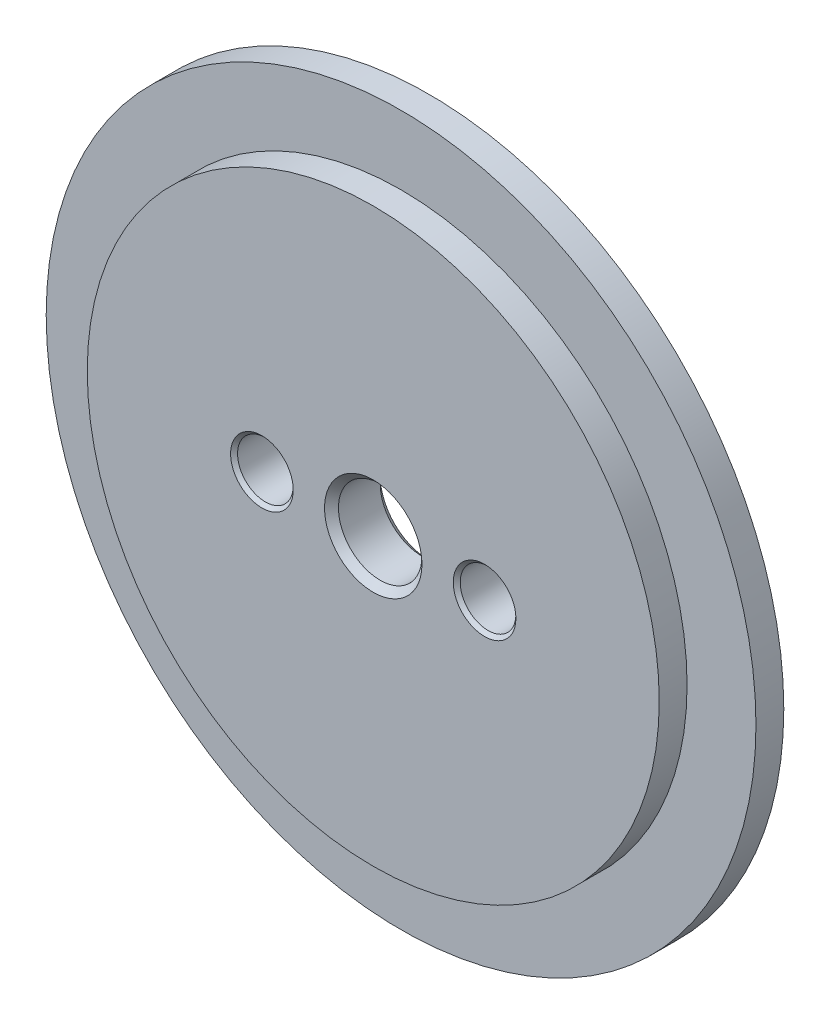
ISO-10303-21;
HEADER;
FILE_DESCRIPTION(('STEP AP214'),'2;1');
FILE_NAME('part.step','',(''),(''),'','','');
FILE_SCHEMA(('AUTOMOTIVE_DESIGN { 1 0 10303 214 1 1 1 1 }'));
ENDSEC;
DATA;
#1=APPLICATION_CONTEXT('core data for automotive mechanical design processes');
#2=APPLICATION_PROTOCOL_DEFINITION('international standard','automotive_design',2000,#1);
#3=PRODUCT_CONTEXT('',#1,'mechanical');
#4=PRODUCT('Part','Part','',(#3));
#5=PRODUCT_RELATED_PRODUCT_CATEGORY('part','',(#4));
#6=PRODUCT_DEFINITION_FORMATION('','',#4);
#7=PRODUCT_DEFINITION_CONTEXT('part definition',#1,'design');
#8=PRODUCT_DEFINITION('design','',#6,#7);
#9=PRODUCT_DEFINITION_SHAPE('','',#8);
#10=(LENGTH_UNIT() NAMED_UNIT(*) SI_UNIT(.MILLI.,.METRE.));
#11=(NAMED_UNIT(*) PLANE_ANGLE_UNIT() SI_UNIT($,.RADIAN.));
#12=(NAMED_UNIT(*) SI_UNIT($,.STERADIAN.) SOLID_ANGLE_UNIT());
#13=UNCERTAINTY_MEASURE_WITH_UNIT(LENGTH_MEASURE(1.E-05),#10,'distance_accuracy_value','');
#14=(GEOMETRIC_REPRESENTATION_CONTEXT(3) GLOBAL_UNCERTAINTY_ASSIGNED_CONTEXT((#13)) GLOBAL_UNIT_ASSIGNED_CONTEXT((#10,
#11,#12)) REPRESENTATION_CONTEXT('',''));
#15=CARTESIAN_POINT('',(0.,0.,0.));
#16=DIRECTION('',(0.,0.,1.));
#17=DIRECTION('',(1.,0.,0.));
#18=AXIS2_PLACEMENT_3D('',#15,#16,#17);
#19=CARTESIAN_POINT('',(0.,0.,2.));
#20=DIRECTION('',(0.,0.,-1.));
#21=DIRECTION('',(-1.,0.,0.));
#22=AXIS2_PLACEMENT_3D('',#19,#20,#21);
#23=CYLINDRICAL_SURFACE('',#22,25.5);
#24=CARTESIAN_POINT('',(0.,0.,2.));
#25=DIRECTION('',(0.,0.,1.));
#26=DIRECTION('',(1.,0.,0.));
#27=AXIS2_PLACEMENT_3D('',#24,#25,#26);
#28=CIRCLE('',#27,25.5);
#29=CARTESIAN_POINT('',(25.5,0.,2.));
#30=VERTEX_POINT('',#29);
#31=EDGE_CURVE('E87',#30,#30,#28,.T.);
#32=ORIENTED_EDGE('',*,*,#31,.F.);
#33=EDGE_LOOP('',(#32));
#34=FACE_BOUND('',#33,.T.);
#35=CARTESIAN_POINT('',(0.,0.,0.));
#36=DIRECTION('',(0.,0.,1.));
#37=DIRECTION('',(1.,0.,0.));
#38=AXIS2_PLACEMENT_3D('',#35,#36,#37);
#39=CIRCLE('',#38,25.5);
#40=CARTESIAN_POINT('',(25.5,0.,0.));
#41=VERTEX_POINT('',#40);
#42=EDGE_CURVE('E84',#41,#41,#39,.T.);
#43=ORIENTED_EDGE('',*,*,#42,.T.);
#44=EDGE_LOOP('',(#43));
#45=FACE_BOUND('',#44,.T.);
#46=ADVANCED_FACE('F38',(#34,#45),#23,.T.);
#47=CARTESIAN_POINT('',(0.,0.,2.));
#48=DIRECTION('',(0.,0.,1.));
#49=DIRECTION('',(1.,0.,0.));
#50=AXIS2_PLACEMENT_3D('',#47,#48,#49);
#51=PLANE('',#50);
#52=CARTESIAN_POINT('',(0.,0.,2.));
#53=DIRECTION('',(0.,0.,1.));
#54=DIRECTION('',(1.,0.,0.));
#55=AXIS2_PLACEMENT_3D('',#52,#53,#54);
#56=CIRCLE('',#55,20.55);
#57=CARTESIAN_POINT('',(20.55,0.,2.));
#58=VERTEX_POINT('',#57);
#59=EDGE_CURVE('E83',#58,#58,#56,.T.);
#60=ORIENTED_EDGE('',*,*,#59,.F.);
#61=EDGE_LOOP('',(#60));
#62=FACE_BOUND('',#61,.T.);
#63=ORIENTED_EDGE('',*,*,#31,.T.);
#64=EDGE_LOOP('',(#63));
#65=FACE_BOUND('',#64,.T.);
#66=ADVANCED_FACE('F105',(#62,#65),#51,.T.);
#67=CARTESIAN_POINT('',(0.,0.,0.));
#68=DIRECTION('',(0.,0.,1.));
#69=DIRECTION('',(1.,0.,0.));
#70=AXIS2_PLACEMENT_3D('',#67,#68,#69);
#71=PLANE('',#70);
#72=CARTESIAN_POINT('',(0.,0.,0.));
#73=DIRECTION('',(0.,0.,1.));
#74=DIRECTION('',(1.,0.,0.));
#75=AXIS2_PLACEMENT_3D('',#72,#73,#74);
#76=CIRCLE('',#75,3.49999999999999);
#77=CARTESIAN_POINT('',(3.49999999999999,0.,0.));
#78=VERTEX_POINT('',#77);
#79=EDGE_CURVE('E46',#78,#78,#76,.T.);
#80=ORIENTED_EDGE('',*,*,#79,.T.);
#81=EDGE_LOOP('',(#80));
#82=FACE_BOUND('',#81,.T.);
#83=CARTESIAN_POINT('',(-8.,0.,0.));
#84=DIRECTION('',(0.,0.,1.));
#85=DIRECTION('',(1.,0.,0.));
#86=AXIS2_PLACEMENT_3D('',#83,#84,#85);
#87=CIRCLE('',#86,2.25);
#88=CARTESIAN_POINT('',(-5.75,0.,0.));
#89=VERTEX_POINT('',#88);
#90=EDGE_CURVE('E62',#89,#89,#87,.T.);
#91=ORIENTED_EDGE('',*,*,#90,.T.);
#92=EDGE_LOOP('',(#91));
#93=FACE_BOUND('',#92,.T.);
#94=CARTESIAN_POINT('',(8.,0.,0.));
#95=DIRECTION('',(0.,0.,1.));
#96=DIRECTION('',(1.,0.,0.));
#97=AXIS2_PLACEMENT_3D('',#94,#95,#96);
#98=CIRCLE('',#97,2.25000000000001);
#99=CARTESIAN_POINT('',(10.25,0.,0.));
#100=VERTEX_POINT('',#99);
#101=EDGE_CURVE('E74',#100,#100,#98,.T.);
#102=ORIENTED_EDGE('',*,*,#101,.T.);
#103=EDGE_LOOP('',(#102));
#104=FACE_BOUND('',#103,.T.);
#105=ORIENTED_EDGE('',*,*,#42,.F.);
#106=EDGE_LOOP('',(#105));
#107=FACE_BOUND('',#106,.T.);
#108=ADVANCED_FACE('F101',(#82,#93,#104,#107),#71,.F.);
#109=CARTESIAN_POINT('',(0.,0.,4.));
#110=DIRECTION('',(0.,0.,-1.));
#111=DIRECTION('',(-1.,0.,0.));
#112=AXIS2_PLACEMENT_3D('',#109,#110,#111);
#113=CYLINDRICAL_SURFACE('',#112,20.55);
#114=CARTESIAN_POINT('',(0.,0.,4.));
#115=DIRECTION('',(0.,0.,1.));
#116=DIRECTION('',(1.,0.,0.));
#117=AXIS2_PLACEMENT_3D('',#114,#115,#116);
#118=CIRCLE('',#117,20.55);
#119=CARTESIAN_POINT('',(20.55,0.,4.));
#120=VERTEX_POINT('',#119);
#121=EDGE_CURVE('E88',#120,#120,#118,.T.);
#122=ORIENTED_EDGE('',*,*,#121,.F.);
#123=EDGE_LOOP('',(#122));
#124=FACE_BOUND('',#123,.T.);
#125=ORIENTED_EDGE('',*,*,#59,.T.);
#126=EDGE_LOOP('',(#125));
#127=FACE_BOUND('',#126,.T.);
#128=ADVANCED_FACE('F98',(#124,#127),#113,.T.);
#129=CARTESIAN_POINT('',(0.,0.,4.));
#130=DIRECTION('',(0.,0.,1.));
#131=DIRECTION('',(1.,0.,0.));
#132=AXIS2_PLACEMENT_3D('',#129,#130,#131);
#133=PLANE('',#132);
#134=CARTESIAN_POINT('',(0.,0.,4.));
#135=DIRECTION('',(0.,0.,1.));
#136=DIRECTION('',(1.,0.,0.));
#137=AXIS2_PLACEMENT_3D('',#134,#135,#136);
#138=CIRCLE('',#137,3.50000000000002);
#139=CARTESIAN_POINT('',(3.50000000000002,0.,4.));
#140=VERTEX_POINT('',#139);
#141=EDGE_CURVE('E10',#140,#140,#138,.F.);
#142=ORIENTED_EDGE('',*,*,#141,.T.);
#143=EDGE_LOOP('',(#142));
#144=FACE_BOUND('',#143,.T.);
#145=CARTESIAN_POINT('',(-8.,0.,4.));
#146=DIRECTION('',(0.,0.,1.));
#147=DIRECTION('',(1.,0.,0.));
#148=AXIS2_PLACEMENT_3D('',#145,#146,#147);
#149=CIRCLE('',#148,2.25000000000002);
#150=CARTESIAN_POINT('',(-5.74999999999998,0.,4.));
#151=VERTEX_POINT('',#150);
#152=EDGE_CURVE('E59',#151,#151,#149,.F.);
#153=ORIENTED_EDGE('',*,*,#152,.T.);
#154=EDGE_LOOP('',(#153));
#155=FACE_BOUND('',#154,.T.);
#156=CARTESIAN_POINT('',(8.,0.,4.));
#157=DIRECTION('',(0.,0.,1.));
#158=DIRECTION('',(1.,0.,0.));
#159=AXIS2_PLACEMENT_3D('',#156,#157,#158);
#160=CIRCLE('',#159,2.25000000000001);
#161=CARTESIAN_POINT('',(10.25,0.,4.));
#162=VERTEX_POINT('',#161);
#163=EDGE_CURVE('E71',#162,#162,#160,.F.);
#164=ORIENTED_EDGE('',*,*,#163,.T.);
#165=EDGE_LOOP('',(#164));
#166=FACE_BOUND('',#165,.T.);
#167=ORIENTED_EDGE('',*,*,#121,.T.);
#168=EDGE_LOOP('',(#167));
#169=FACE_BOUND('',#168,.T.);
#170=ADVANCED_FACE('F96',(#144,#155,#166,#169),#133,.T.);
#171=CARTESIAN_POINT('',(0.,0.,4.));
#172=DIRECTION('',(0.,0.,-1.));
#173=DIRECTION('',(-1.,0.,0.));
#174=AXIS2_PLACEMENT_3D('',#171,#172,#173);
#175=CYLINDRICAL_SURFACE('',#174,3.);
#176=CARTESIAN_POINT('',(0.,0.,0.499999999999993));
#177=DIRECTION('',(0.,0.,1.));
#178=DIRECTION('',(1.,0.,0.));
#179=AXIS2_PLACEMENT_3D('',#176,#177,#178);
#180=CIRCLE('',#179,3.);
#181=CARTESIAN_POINT('',(3.,0.,0.499999999999993));
#182=VERTEX_POINT('',#181);
#183=EDGE_CURVE('E50',#182,#182,#180,.F.);
#184=ORIENTED_EDGE('',*,*,#183,.T.);
#185=EDGE_LOOP('',(#184));
#186=FACE_BOUND('',#185,.T.);
#187=CARTESIAN_POINT('',(0.,0.,3.49999999999999));
#188=DIRECTION('',(0.,0.,1.));
#189=DIRECTION('',(1.,0.,0.));
#190=AXIS2_PLACEMENT_3D('',#187,#188,#189);
#191=CIRCLE('',#190,3.);
#192=CARTESIAN_POINT('',(3.,0.,3.49999999999999));
#193=VERTEX_POINT('',#192);
#194=EDGE_CURVE('E54',#193,#193,#191,.T.);
#195=ORIENTED_EDGE('',*,*,#194,.T.);
#196=EDGE_LOOP('',(#195));
#197=FACE_BOUND('',#196,.T.);
#198=ADVANCED_FACE('F163',(#186,#197),#175,.F.);
#199=CARTESIAN_POINT('',(-8.,0.,4.));
#200=DIRECTION('',(0.,0.,-1.));
#201=DIRECTION('',(-1.,0.,0.));
#202=AXIS2_PLACEMENT_3D('',#199,#200,#201);
#203=CYLINDRICAL_SURFACE('',#202,2.);
#204=CARTESIAN_POINT('',(-8.,0.,0.250000000000009));
#205=DIRECTION('',(0.,0.,1.));
#206=DIRECTION('',(1.,0.,0.));
#207=AXIS2_PLACEMENT_3D('',#204,#205,#206);
#208=CIRCLE('',#207,2.);
#209=CARTESIAN_POINT('',(-6.,0.,0.250000000000009));
#210=VERTEX_POINT('',#209);
#211=EDGE_CURVE('E65',#210,#210,#208,.F.);
#212=ORIENTED_EDGE('',*,*,#211,.T.);
#213=EDGE_LOOP('',(#212));
#214=FACE_BOUND('',#213,.T.);
#215=CARTESIAN_POINT('',(-8.,0.,3.74999999999998));
#216=DIRECTION('',(0.,0.,1.));
#217=DIRECTION('',(1.,0.,0.));
#218=AXIS2_PLACEMENT_3D('',#215,#216,#217);
#219=CIRCLE('',#218,2.);
#220=CARTESIAN_POINT('',(-6.,0.,3.74999999999998));
#221=VERTEX_POINT('',#220);
#222=EDGE_CURVE('E68',#221,#221,#219,.T.);
#223=ORIENTED_EDGE('',*,*,#222,.T.);
#224=EDGE_LOOP('',(#223));
#225=FACE_BOUND('',#224,.T.);
#226=ADVANCED_FACE('F166',(#214,#225),#203,.F.);
#227=CARTESIAN_POINT('',(8.,0.,4.));
#228=DIRECTION('',(0.,0.,-1.));
#229=DIRECTION('',(-1.,0.,0.));
#230=AXIS2_PLACEMENT_3D('',#227,#228,#229);
#231=CYLINDRICAL_SURFACE('',#230,2.);
#232=CARTESIAN_POINT('',(8.,0.,0.250000000000008));
#233=DIRECTION('',(0.,0.,1.));
#234=DIRECTION('',(1.,0.,0.));
#235=AXIS2_PLACEMENT_3D('',#232,#233,#234);
#236=CIRCLE('',#235,2.);
#237=CARTESIAN_POINT('',(10.,0.,0.250000000000008));
#238=VERTEX_POINT('',#237);
#239=EDGE_CURVE('E77',#238,#238,#236,.F.);
#240=ORIENTED_EDGE('',*,*,#239,.T.);
#241=EDGE_LOOP('',(#240));
#242=FACE_BOUND('',#241,.T.);
#243=CARTESIAN_POINT('',(8.,0.,3.75));
#244=DIRECTION('',(0.,0.,1.));
#245=DIRECTION('',(1.,0.,0.));
#246=AXIS2_PLACEMENT_3D('',#243,#244,#245);
#247=CIRCLE('',#246,2.);
#248=CARTESIAN_POINT('',(10.,0.,3.75));
#249=VERTEX_POINT('',#248);
#250=EDGE_CURVE('E80',#249,#249,#247,.T.);
#251=ORIENTED_EDGE('',*,*,#250,.T.);
#252=EDGE_LOOP('',(#251));
#253=FACE_BOUND('',#252,.T.);
#254=ADVANCED_FACE('F130',(#242,#253),#231,.F.);
#255=CARTESIAN_POINT('',(8.,0.,0.250000000000008));
#256=DIRECTION('',(0.,0.,-1.));
#257=DIRECTION('',(-1.,0.,0.));
#258=AXIS2_PLACEMENT_3D('',#255,#256,#257);
#259=CONICAL_SURFACE('',#258,2.,0.785398163397448);
#260=ORIENTED_EDGE('',*,*,#101,.F.);
#261=EDGE_LOOP('',(#260));
#262=FACE_BOUND('',#261,.T.);
#263=ORIENTED_EDGE('',*,*,#239,.F.);
#264=EDGE_LOOP('',(#263));
#265=FACE_BOUND('',#264,.T.);
#266=ADVANCED_FACE('F123',(#262,#265),#259,.F.);
#267=CARTESIAN_POINT('',(8.,0.,4.));
#268=DIRECTION('',(0.,0.,1.));
#269=DIRECTION('',(1.,0.,0.));
#270=AXIS2_PLACEMENT_3D('',#267,#268,#269);
#271=CONICAL_SURFACE('',#270,2.25000000000001,0.785398163397462);
#272=ORIENTED_EDGE('',*,*,#250,.F.);
#273=EDGE_LOOP('',(#272));
#274=FACE_BOUND('',#273,.T.);
#275=ORIENTED_EDGE('',*,*,#163,.F.);
#276=EDGE_LOOP('',(#275));
#277=FACE_BOUND('',#276,.T.);
#278=ADVANCED_FACE('F129',(#274,#277),#271,.F.);
#279=CARTESIAN_POINT('',(-8.,0.,0.250000000000009));
#280=DIRECTION('',(0.,0.,-1.));
#281=DIRECTION('',(-1.,0.,0.));
#282=AXIS2_PLACEMENT_3D('',#279,#280,#281);
#283=CONICAL_SURFACE('',#282,2.,0.785398163397434);
#284=ORIENTED_EDGE('',*,*,#90,.F.);
#285=EDGE_LOOP('',(#284));
#286=FACE_BOUND('',#285,.T.);
#287=ORIENTED_EDGE('',*,*,#211,.F.);
#288=EDGE_LOOP('',(#287));
#289=FACE_BOUND('',#288,.T.);
#290=ADVANCED_FACE('F137',(#286,#289),#283,.F.);
#291=CARTESIAN_POINT('',(-8.,0.,4.));
#292=DIRECTION('',(0.,0.,1.));
#293=DIRECTION('',(1.,0.,0.));
#294=AXIS2_PLACEMENT_3D('',#291,#292,#293);
#295=CONICAL_SURFACE('',#294,2.25000000000002,0.785398163397448);
#296=ORIENTED_EDGE('',*,*,#222,.F.);
#297=EDGE_LOOP('',(#296));
#298=FACE_BOUND('',#297,.T.);
#299=ORIENTED_EDGE('',*,*,#152,.F.);
#300=EDGE_LOOP('',(#299));
#301=FACE_BOUND('',#300,.T.);
#302=ADVANCED_FACE('F144',(#298,#301),#295,.F.);
#303=CARTESIAN_POINT('',(0.,0.,0.499999999999993));
#304=DIRECTION('',(0.,0.,-1.));
#305=DIRECTION('',(-1.,0.,0.));
#306=AXIS2_PLACEMENT_3D('',#303,#304,#305);
#307=CONICAL_SURFACE('',#306,3.,0.785398163397445);
#308=ORIENTED_EDGE('',*,*,#79,.F.);
#309=EDGE_LOOP('',(#308));
#310=FACE_BOUND('',#309,.T.);
#311=ORIENTED_EDGE('',*,*,#183,.F.);
#312=EDGE_LOOP('',(#311));
#313=FACE_BOUND('',#312,.T.);
#314=ADVANCED_FACE('F150',(#310,#313),#307,.F.);
#315=CARTESIAN_POINT('',(0.,0.,4.));
#316=DIRECTION('',(0.,0.,1.));
#317=DIRECTION('',(1.,0.,0.));
#318=AXIS2_PLACEMENT_3D('',#315,#316,#317);
#319=CONICAL_SURFACE('',#318,3.50000000000002,0.785398163397459);
#320=ORIENTED_EDGE('',*,*,#194,.F.);
#321=EDGE_LOOP('',(#320));
#322=FACE_BOUND('',#321,.T.);
#323=ORIENTED_EDGE('',*,*,#141,.F.);
#324=EDGE_LOOP('',(#323));
#325=FACE_BOUND('',#324,.T.);
#326=ADVANCED_FACE('F41',(#322,#325),#319,.F.);
#327=CLOSED_SHELL('',(#46,#66,#108,#128,#170,#198,#226,#254,#266,#278,#290,#302,#314,#326));
#328=MANIFOLD_SOLID_BREP('B2',#327);
#329=ADVANCED_BREP_SHAPE_REPRESENTATION('',(#18,#328),#14);
#330=SHAPE_DEFINITION_REPRESENTATION(#9,#329);
ENDSEC;
END-ISO-10303-21;
